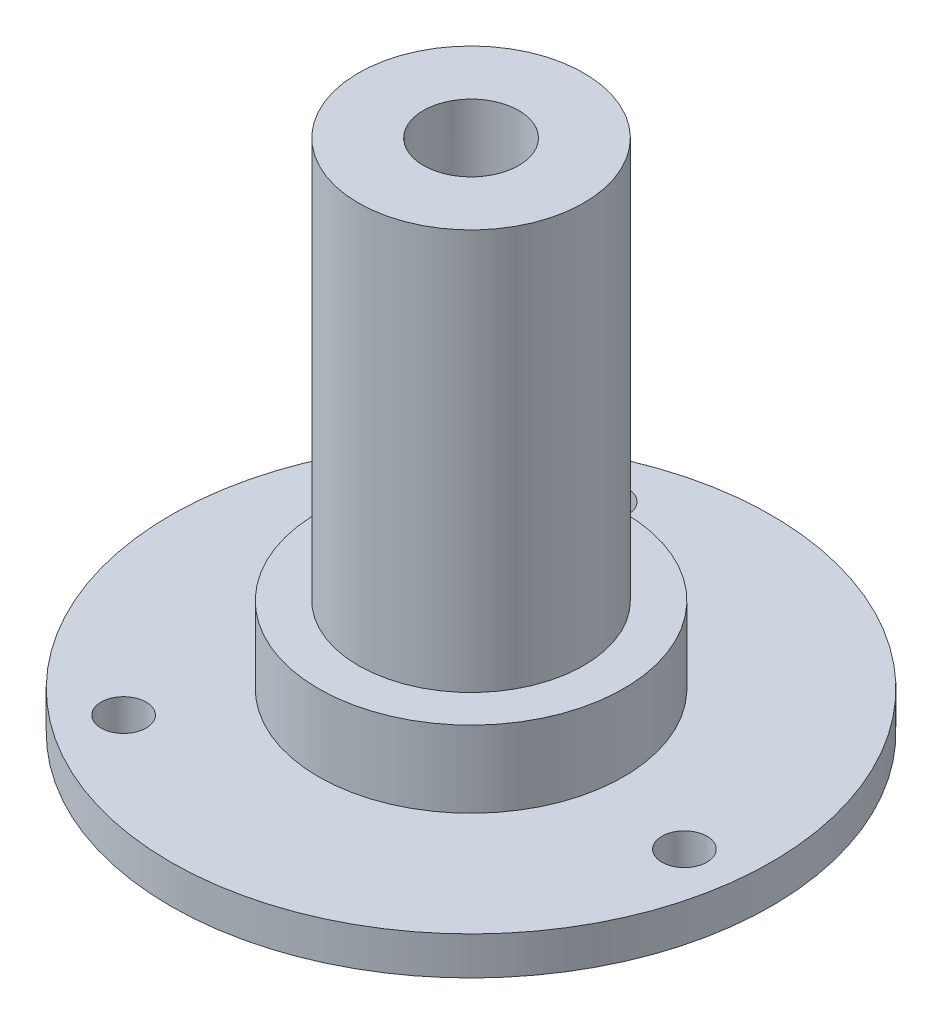
ISO-10303-21;
HEADER;
FILE_DESCRIPTION(('STEP AP214'),'2;1');
FILE_NAME('part.step','',(''),(''),'','','');
FILE_SCHEMA(('AUTOMOTIVE_DESIGN { 1 0 10303 214 1 1 1 1 }'));
ENDSEC;
DATA;
#1=APPLICATION_CONTEXT('core data for automotive mechanical design processes');
#2=APPLICATION_PROTOCOL_DEFINITION('international standard','automotive_design',2000,#1);
#3=PRODUCT_CONTEXT('',#1,'mechanical');
#4=PRODUCT('Part','Part','',(#3));
#5=PRODUCT_RELATED_PRODUCT_CATEGORY('part','',(#4));
#6=PRODUCT_DEFINITION_FORMATION('','',#4);
#7=PRODUCT_DEFINITION_CONTEXT('part definition',#1,'design');
#8=PRODUCT_DEFINITION('design','',#6,#7);
#9=PRODUCT_DEFINITION_SHAPE('','',#8);
#10=(LENGTH_UNIT() NAMED_UNIT(*) SI_UNIT(.MILLI.,.METRE.));
#11=(NAMED_UNIT(*) PLANE_ANGLE_UNIT() SI_UNIT($,.RADIAN.));
#12=(NAMED_UNIT(*) SI_UNIT($,.STERADIAN.) SOLID_ANGLE_UNIT());
#13=UNCERTAINTY_MEASURE_WITH_UNIT(LENGTH_MEASURE(1.E-05),#10,'distance_accuracy_value','');
#14=(GEOMETRIC_REPRESENTATION_CONTEXT(3) GLOBAL_UNCERTAINTY_ASSIGNED_CONTEXT((#13)) GLOBAL_UNIT_ASSIGNED_CONTEXT((#10,
#11,#12)) REPRESENTATION_CONTEXT('',''));
#15=CARTESIAN_POINT('',(0.,0.,0.));
#16=DIRECTION('',(0.,0.,1.));
#17=DIRECTION('',(1.,0.,0.));
#18=AXIS2_PLACEMENT_3D('',#15,#16,#17);
#19=CARTESIAN_POINT('',(0.,0.,0.));
#20=DIRECTION('',(0.,1.,0.));
#21=DIRECTION('',(0.,0.,1.));
#22=AXIS2_PLACEMENT_3D('',#19,#20,#21);
#23=CYLINDRICAL_SURFACE('',#22,3.175);
#24=CARTESIAN_POINT('',(0.,0.,0.));
#25=DIRECTION('',(0.,1.,0.));
#26=DIRECTION('',(0.,0.,1.));
#27=AXIS2_PLACEMENT_3D('',#24,#25,#26);
#28=CIRCLE('',#27,3.175);
#29=CARTESIAN_POINT('',(0.,0.,3.175));
#30=VERTEX_POINT('',#29);
#31=EDGE_CURVE('E142',#30,#30,#28,.T.);
#32=ORIENTED_EDGE('',*,*,#31,.F.);
#33=EDGE_LOOP('',(#32));
#34=FACE_BOUND('',#33,.T.);
#35=CARTESIAN_POINT('',(0.,2.54,0.));
#36=DIRECTION('',(0.,1.,0.));
#37=DIRECTION('',(0.,0.,1.));
#38=AXIS2_PLACEMENT_3D('',#35,#36,#37);
#39=CIRCLE('',#38,3.175);
#40=CARTESIAN_POINT('',(0.,2.54,3.175));
#41=VERTEX_POINT('',#40);
#42=EDGE_CURVE('E10',#41,#41,#39,.F.);
#43=ORIENTED_EDGE('',*,*,#42,.F.);
#44=EDGE_LOOP('',(#43));
#45=FACE_BOUND('',#44,.T.);
#46=ADVANCED_FACE('F32',(#34,#45),#23,.F.);
#47=CARTESIAN_POINT('',(0.,2.54,0.));
#48=DIRECTION('',(0.,-1.,0.));
#49=DIRECTION('',(0.,0.,-1.));
#50=AXIS2_PLACEMENT_3D('',#47,#48,#49);
#51=CYLINDRICAL_SURFACE('',#50,20.);
#52=CARTESIAN_POINT('',(0.,2.54,0.));
#53=DIRECTION('',(0.,1.,0.));
#54=DIRECTION('',(0.,0.,1.));
#55=AXIS2_PLACEMENT_3D('',#52,#53,#54);
#56=CIRCLE('',#55,20.);
#57=CARTESIAN_POINT('',(0.,2.54,20.));
#58=VERTEX_POINT('',#57);
#59=EDGE_CURVE('E40',#58,#58,#56,.T.);
#60=ORIENTED_EDGE('',*,*,#59,.F.);
#61=EDGE_LOOP('',(#60));
#62=FACE_BOUND('',#61,.T.);
#63=CARTESIAN_POINT('',(0.,0.,0.));
#64=DIRECTION('',(0.,1.,0.));
#65=DIRECTION('',(0.,0.,1.));
#66=AXIS2_PLACEMENT_3D('',#63,#64,#65);
#67=CIRCLE('',#66,20.);
#68=CARTESIAN_POINT('',(0.,0.,20.));
#69=VERTEX_POINT('',#68);
#70=EDGE_CURVE('E44',#69,#69,#67,.T.);
#71=ORIENTED_EDGE('',*,*,#70,.T.);
#72=EDGE_LOOP('',(#71));
#73=FACE_BOUND('',#72,.T.);
#74=ADVANCED_FACE('F34',(#62,#73),#51,.T.);
#75=CARTESIAN_POINT('',(0.,2.54,0.));
#76=DIRECTION('',(0.,1.,0.));
#77=DIRECTION('',(0.,0.,1.));
#78=AXIS2_PLACEMENT_3D('',#75,#76,#77);
#79=PLANE('',#78);
#80=CARTESIAN_POINT('',(0.,2.54,0.));
#81=DIRECTION('',(0.,1.,0.));
#82=DIRECTION('',(0.,0.,1.));
#83=AXIS2_PLACEMENT_3D('',#80,#81,#82);
#84=CIRCLE('',#83,10.16);
#85=CARTESIAN_POINT('',(0.,2.54,10.16));
#86=VERTEX_POINT('',#85);
#87=EDGE_CURVE('E191',#86,#86,#84,.T.);
#88=ORIENTED_EDGE('',*,*,#87,.F.);
#89=EDGE_LOOP('',(#88));
#90=FACE_BOUND('',#89,.T.);
#91=CARTESIAN_POINT('',(-10.0438146715116,2.54,13.0893541200269));
#92=DIRECTION('',(0.,1.,0.));
#93=DIRECTION('',(0.,0.,1.));
#94=AXIS2_PLACEMENT_3D('',#91,#92,#93);
#95=CIRCLE('',#94,1.5000000000005);
#96=CARTESIAN_POINT('',(-10.0438146715116,2.54,14.5893541200274));
#97=VERTEX_POINT('',#96);
#98=EDGE_CURVE('E155',#97,#97,#95,.T.);
#99=ORIENTED_EDGE('',*,*,#98,.F.);
#100=EDGE_LOOP('',(#99));
#101=FACE_BOUND('',#100,.T.);
#102=CARTESIAN_POINT('',(16.3576205228284,2.54,2.15352159641826));
#103=DIRECTION('',(0.,1.,0.));
#104=DIRECTION('',(0.,0.,1.));
#105=AXIS2_PLACEMENT_3D('',#102,#103,#104);
#106=CIRCLE('',#105,1.50000000000133);
#107=CARTESIAN_POINT('',(16.3576205228284,2.54,3.65352159641959));
#108=VERTEX_POINT('',#107);
#109=EDGE_CURVE('E150',#108,#108,#106,.T.);
#110=ORIENTED_EDGE('',*,*,#109,.F.);
#111=EDGE_LOOP('',(#110));
#112=FACE_BOUND('',#111,.T.);
#113=CARTESIAN_POINT('',(-6.31380585131877,2.54,-15.2428757164443));
#114=DIRECTION('',(0.,1.,0.));
#115=DIRECTION('',(0.,0.,1.));
#116=AXIS2_PLACEMENT_3D('',#113,#114,#115);
#117=CIRCLE('',#116,1.5);
#118=CARTESIAN_POINT('',(-6.31380585131877,2.54,-13.7428757164443));
#119=VERTEX_POINT('',#118);
#120=EDGE_CURVE('E161',#119,#119,#117,.T.);
#121=ORIENTED_EDGE('',*,*,#120,.F.);
#122=EDGE_LOOP('',(#121));
#123=FACE_BOUND('',#122,.T.);
#124=ORIENTED_EDGE('',*,*,#59,.T.);
#125=EDGE_LOOP('',(#124));
#126=FACE_BOUND('',#125,.T.);
#127=ADVANCED_FACE('F98',(#90,#101,#112,#123,#126),#79,.T.);
#128=CARTESIAN_POINT('',(0.,0.,0.));
#129=DIRECTION('',(0.,1.,0.));
#130=DIRECTION('',(0.,0.,1.));
#131=AXIS2_PLACEMENT_3D('',#128,#129,#130);
#132=PLANE('',#131);
#133=ORIENTED_EDGE('',*,*,#31,.T.);
#134=EDGE_LOOP('',(#133));
#135=FACE_BOUND('',#134,.T.);
#136=CARTESIAN_POINT('',(-10.0438146715116,0.,13.0893541200269));
#137=DIRECTION('',(0.,-1.,0.));
#138=DIRECTION('',(0.,0.,-1.));
#139=AXIS2_PLACEMENT_3D('',#136,#137,#138);
#140=CIRCLE('',#139,1.5000000000005);
#141=CARTESIAN_POINT('',(-10.0438146715116,0.,11.5893541200264));
#142=VERTEX_POINT('',#141);
#143=EDGE_CURVE('E147',#142,#142,#140,.T.);
#144=ORIENTED_EDGE('',*,*,#143,.F.);
#145=EDGE_LOOP('',(#144));
#146=FACE_BOUND('',#145,.T.);
#147=CARTESIAN_POINT('',(16.3576205228284,0.,2.15352159641826));
#148=DIRECTION('',(0.,-1.,0.));
#149=DIRECTION('',(0.,0.,-1.));
#150=AXIS2_PLACEMENT_3D('',#147,#148,#149);
#151=CIRCLE('',#150,1.50000000000133);
#152=CARTESIAN_POINT('',(16.3576205228284,0.,0.653521596416927));
#153=VERTEX_POINT('',#152);
#154=EDGE_CURVE('E144',#153,#153,#151,.T.);
#155=ORIENTED_EDGE('',*,*,#154,.F.);
#156=EDGE_LOOP('',(#155));
#157=FACE_BOUND('',#156,.T.);
#158=CARTESIAN_POINT('',(-6.31380585131877,0.,-15.2428757164443));
#159=DIRECTION('',(0.,-1.,0.));
#160=DIRECTION('',(0.,0.,-1.));
#161=AXIS2_PLACEMENT_3D('',#158,#159,#160);
#162=CIRCLE('',#161,1.5);
#163=CARTESIAN_POINT('',(-6.31380585131877,0.,-16.7428757164443));
#164=VERTEX_POINT('',#163);
#165=EDGE_CURVE('E158',#164,#164,#162,.T.);
#166=ORIENTED_EDGE('',*,*,#165,.F.);
#167=EDGE_LOOP('',(#166));
#168=FACE_BOUND('',#167,.T.);
#169=ORIENTED_EDGE('',*,*,#70,.F.);
#170=EDGE_LOOP('',(#169));
#171=FACE_BOUND('',#170,.T.);
#172=ADVANCED_FACE('F101',(#135,#146,#157,#168,#171),#132,.F.);
#173=CARTESIAN_POINT('',(-6.31380585131877,34.29,-15.2428757164443));
#174=DIRECTION('',(0.,-1.,0.));
#175=DIRECTION('',(0.,0.,-1.));
#176=AXIS2_PLACEMENT_3D('',#173,#174,#175);
#177=CYLINDRICAL_SURFACE('',#176,1.5);
#178=ORIENTED_EDGE('',*,*,#120,.T.);
#179=EDGE_LOOP('',(#178));
#180=FACE_BOUND('',#179,.T.);
#181=ORIENTED_EDGE('',*,*,#165,.T.);
#182=EDGE_LOOP('',(#181));
#183=FACE_BOUND('',#182,.T.);
#184=ADVANCED_FACE('F104',(#180,#183),#177,.F.);
#185=CARTESIAN_POINT('',(16.3576205228284,34.29,2.15352159641826));
#186=DIRECTION('',(0.,-1.,0.));
#187=DIRECTION('',(0.,0.,-1.));
#188=AXIS2_PLACEMENT_3D('',#185,#186,#187);
#189=CYLINDRICAL_SURFACE('',#188,1.50000000000133);
#190=ORIENTED_EDGE('',*,*,#109,.T.);
#191=EDGE_LOOP('',(#190));
#192=FACE_BOUND('',#191,.T.);
#193=ORIENTED_EDGE('',*,*,#154,.T.);
#194=EDGE_LOOP('',(#193));
#195=FACE_BOUND('',#194,.T.);
#196=ADVANCED_FACE('F109',(#192,#195),#189,.F.);
#197=CARTESIAN_POINT('',(-10.0438146715116,34.29,13.0893541200269));
#198=DIRECTION('',(0.,-1.,0.));
#199=DIRECTION('',(0.,0.,-1.));
#200=AXIS2_PLACEMENT_3D('',#197,#198,#199);
#201=CYLINDRICAL_SURFACE('',#200,1.5000000000005);
#202=ORIENTED_EDGE('',*,*,#98,.T.);
#203=EDGE_LOOP('',(#202));
#204=FACE_BOUND('',#203,.T.);
#205=ORIENTED_EDGE('',*,*,#143,.T.);
#206=EDGE_LOOP('',(#205));
#207=FACE_BOUND('',#206,.T.);
#208=ADVANCED_FACE('F216',(#204,#207),#201,.F.);
#209=CARTESIAN_POINT('',(0.,2.54,0.));
#210=DIRECTION('',(0.,1.,0.));
#211=DIRECTION('',(0.,0.,1.));
#212=AXIS2_PLACEMENT_3D('',#209,#210,#211);
#213=PLANE('',#212);
#214=ORIENTED_EDGE('',*,*,#42,.T.);
#215=EDGE_LOOP('',(#214));
#216=FACE_BOUND('',#215,.T.);
#217=ADVANCED_FACE('F183',(#216),#213,.F.);
#218=CARTESIAN_POINT('',(0.,7.62,0.));
#219=DIRECTION('',(0.,1.,0.));
#220=DIRECTION('',(0.,0.,1.));
#221=AXIS2_PLACEMENT_3D('',#218,#219,#220);
#222=PLANE('',#221);
#223=CARTESIAN_POINT('',(0.,7.62,0.));
#224=DIRECTION('',(0.,1.,0.));
#225=DIRECTION('',(0.,0.,1.));
#226=AXIS2_PLACEMENT_3D('',#223,#224,#225);
#227=CIRCLE('',#226,10.16);
#228=CARTESIAN_POINT('',(0.,7.62,10.16));
#229=VERTEX_POINT('',#228);
#230=EDGE_CURVE('E188',#229,#229,#227,.T.);
#231=ORIENTED_EDGE('',*,*,#230,.T.);
#232=EDGE_LOOP('',(#231));
#233=FACE_BOUND('',#232,.T.);
#234=CARTESIAN_POINT('',(0.,7.62,0.));
#235=DIRECTION('',(0.,1.,0.));
#236=DIRECTION('',(0.,0.,1.));
#237=AXIS2_PLACEMENT_3D('',#234,#235,#236);
#238=CIRCLE('',#237,7.499999986);
#239=CARTESIAN_POINT('',(0.,7.62,7.499999986));
#240=VERTEX_POINT('',#239);
#241=EDGE_CURVE('E56',#240,#240,#238,.T.);
#242=ORIENTED_EDGE('',*,*,#241,.F.);
#243=EDGE_LOOP('',(#242));
#244=FACE_BOUND('',#243,.T.);
#245=ADVANCED_FACE('F129',(#233,#244),#222,.T.);
#246=CARTESIAN_POINT('',(0.,7.62,0.));
#247=DIRECTION('',(0.,-1.,0.));
#248=DIRECTION('',(0.,0.,-1.));
#249=AXIS2_PLACEMENT_3D('',#246,#247,#248);
#250=CYLINDRICAL_SURFACE('',#249,10.16);
#251=ORIENTED_EDGE('',*,*,#230,.F.);
#252=EDGE_LOOP('',(#251));
#253=FACE_BOUND('',#252,.T.);
#254=ORIENTED_EDGE('',*,*,#87,.T.);
#255=EDGE_LOOP('',(#254));
#256=FACE_BOUND('',#255,.T.);
#257=ADVANCED_FACE('F72',(#253,#256),#250,.T.);
#258=CARTESIAN_POINT('',(0.,34.29,0.));
#259=DIRECTION('',(0.,1.,0.));
#260=DIRECTION('',(0.,0.,1.));
#261=AXIS2_PLACEMENT_3D('',#258,#259,#260);
#262=PLANE('',#261);
#263=CARTESIAN_POINT('',(0.,34.29,0.));
#264=DIRECTION('',(0.,1.,0.));
#265=DIRECTION('',(0.,0.,1.));
#266=AXIS2_PLACEMENT_3D('',#263,#264,#265);
#267=CIRCLE('',#266,3.175);
#268=CARTESIAN_POINT('',(0.,34.29,3.175));
#269=VERTEX_POINT('',#268);
#270=EDGE_CURVE('E140',#269,#269,#267,.T.);
#271=ORIENTED_EDGE('',*,*,#270,.F.);
#272=EDGE_LOOP('',(#271));
#273=FACE_BOUND('',#272,.T.);
#274=CARTESIAN_POINT('',(0.,34.29,0.));
#275=DIRECTION('',(0.,1.,0.));
#276=DIRECTION('',(0.,0.,1.));
#277=AXIS2_PLACEMENT_3D('',#274,#275,#276);
#278=CIRCLE('',#277,7.499999986);
#279=CARTESIAN_POINT('',(0.,34.29,7.499999986));
#280=VERTEX_POINT('',#279);
#281=EDGE_CURVE('E164',#280,#280,#278,.T.);
#282=ORIENTED_EDGE('',*,*,#281,.T.);
#283=EDGE_LOOP('',(#282));
#284=FACE_BOUND('',#283,.T.);
#285=ADVANCED_FACE('F96',(#273,#284),#262,.T.);
#286=CARTESIAN_POINT('',(-20.,22.29,0.));
#287=DIRECTION('',(1.,0.,0.));
#288=DIRECTION('',(0.,0.,-1.));
#289=AXIS2_PLACEMENT_3D('',#286,#287,#288);
#290=CYLINDRICAL_SURFACE('',#289,1.397);
#291=CARTESIAN_POINT('',(-2.85114292872174,22.29,-1.397));
#292=CARTESIAN_POINT('',(-2.85115237351835,22.2159268114621,-1.39699065371324));
#293=CARTESIAN_POINT('',(-2.85407201783555,22.1417516850457,-1.39107141452209));
#294=CARTESIAN_POINT('',(-2.86537105010901,21.9955687487075,-1.36763678442378));
#295=CARTESIAN_POINT('',(-2.87376444664616,21.9235669969876,-1.3500916383119));
#296=CARTESIAN_POINT('',(-2.89485679097946,21.7841216818082,-1.30424614599699));
#297=CARTESIAN_POINT('',(-2.90753678551636,21.7166595940755,-1.27599307955427));
#298=CARTESIAN_POINT('',(-2.93574659643726,21.5874498661741,-1.20967369800455));
#299=CARTESIAN_POINT('',(-2.95127596563693,21.5257013315977,-1.17160892238019));
#300=CARTESIAN_POINT('',(-2.98464090455019,21.4053420245741,-1.0839173194949));
#301=CARTESIAN_POINT('',(-3.00256017960633,21.3471756089834,-1.0337121734898));
#302=CARTESIAN_POINT('',(-3.0380018380997,21.2397550261967,-0.924376309969724));
#303=CARTESIAN_POINT('',(-3.055524055301,21.1905045336442,-0.86524193065772));
#304=CARTESIAN_POINT('',(-3.08923496638304,21.099953197666,-0.736146899468411));
#305=CARTESIAN_POINT('',(-3.10531516695498,21.0591646567176,-0.665795972060948));
#306=CARTESIAN_POINT('',(-3.13328998408337,20.9901970393407,-0.518393954944971));
#307=CARTESIAN_POINT('',(-3.1451866614389,20.9620117526991,-0.441346187486855));
#308=CARTESIAN_POINT('',(-3.16285806619951,20.9206996977336,-0.287414778923227));
#309=CARTESIAN_POINT('',(-3.16894424098825,20.9068033130397,-0.210774193800686));
#310=CARTESIAN_POINT('',(-3.17544845547862,20.8919641034125,-0.0560240862312617));
#311=CARTESIAN_POINT('',(-3.17586907757888,20.8910153768434,0.022084750717096));
#312=CARTESIAN_POINT('',(-3.17116900154512,20.9017226799324,0.171909439782902));
#313=CARTESIAN_POINT('',(-3.16642165087473,20.9125294248871,0.24370000391672));
#314=CARTESIAN_POINT('',(-3.15244550602921,20.9449683903399,0.384326949447742));
#315=CARTESIAN_POINT('',(-3.14321638012469,20.9666014121746,0.453163111757223));
#316=CARTESIAN_POINT('',(-3.12097860594305,21.0203164638681,0.587203351522346));
#317=CARTESIAN_POINT('',(-3.1079143803762,21.0525530505242,0.652335890138428));
#318=CARTESIAN_POINT('',(-3.07925817812088,21.1263971233842,0.776438317360146));
#319=CARTESIAN_POINT('',(-3.06366528356653,21.1680080144513,0.835405955375684));
#320=CARTESIAN_POINT('',(-3.03006776985349,21.2631482631757,0.950353661142522));
#321=CARTESIAN_POINT('',(-3.01196989645416,21.3173502597936,1.00575048811671));
#322=CARTESIAN_POINT('',(-2.97627243690402,21.4342673302773,1.10693826469219));
#323=CARTESIAN_POINT('',(-2.95867309274512,21.4969864556846,1.15272461610552));
#324=CARTESIAN_POINT('',(-2.92525432672669,21.6323089438104,1.23514086723043));
#325=CARTESIAN_POINT('',(-2.90953477297595,21.7052081051539,1.27132919138321));
#326=CARTESIAN_POINT('',(-2.88288185240244,21.8569380810136,1.33067189110848));
#327=CARTESIAN_POINT('',(-2.87194461119493,21.9357640330389,1.35383682193193));
#328=CARTESIAN_POINT('',(-2.85708899602545,22.0912496267258,1.3848992054064));
#329=CARTESIAN_POINT('',(-2.85273381561134,22.1676761500265,1.39374985362834));
#330=CARTESIAN_POINT('',(-2.85028280058242,22.3210301876081,1.39875824343376));
#331=CARTESIAN_POINT('',(-2.85218434839454,22.3979574789473,1.39492129301443));
#332=CARTESIAN_POINT('',(-2.86157722575447,22.5440324471271,1.37553552668914));
#333=CARTESIAN_POINT('',(-2.86863871458494,22.6133309360522,1.36088649715055));
#334=CARTESIAN_POINT('',(-2.88698336965366,22.748411716313,1.32152182874358));
#335=CARTESIAN_POINT('',(-2.89826760159835,22.8141931152365,1.29680364855362));
#336=CARTESIAN_POINT('',(-2.92439244326778,22.9436499193854,1.23679686862192));
#337=CARTESIAN_POINT('',(-2.93936876620891,23.0071019674859,1.20108748926754));
#338=CARTESIAN_POINT('',(-2.97101722516595,23.1274393066735,1.12051485206167));
#339=CARTESIAN_POINT('',(-2.98769014785859,23.1843215251332,1.07564733799245));
#340=CARTESIAN_POINT('',(-3.02271731647178,23.2954037762479,0.973138693965348));
#341=CARTESIAN_POINT('',(-3.04108409203716,23.348865860621,0.914698839635639));
#342=CARTESIAN_POINT('',(-3.07602015444843,23.4453835297442,0.789277579543786));
#343=CARTESIAN_POINT('',(-3.09258920896537,23.4884377703146,0.722295072197236));
#344=CARTESIAN_POINT('',(-3.1222658607023,23.5630718171182,0.580807627369469));
#345=CARTESIAN_POINT('',(-3.1353466779445,23.5945635123384,0.506250237967001));
#346=CARTESIAN_POINT('',(-3.15636397616119,23.6443007086138,0.352165202603912));
#347=CARTESIAN_POINT('',(-3.16430391016354,23.6625551018893,0.27264093224431));
#348=CARTESIAN_POINT('',(-3.1737066814273,23.6840882230022,0.117434515311565));
#349=CARTESIAN_POINT('',(-3.17561775975148,23.6884039302117,0.0419225938853239));
#350=CARTESIAN_POINT('',(-3.17403067411367,23.6847969635917,-0.108741515299149));
#351=CARTESIAN_POINT('',(-3.17053366389819,23.6768769001077,-0.183893776355563));
#352=CARTESIAN_POINT('',(-3.15877144263482,23.6497646425261,-0.328362162745011));
#353=CARTESIAN_POINT('',(-3.15071704382124,23.6310701756749,-0.39779036890816));
#354=CARTESIAN_POINT('',(-3.13077187732552,23.5835150033947,-0.532476762229073));
#355=CARTESIAN_POINT('',(-3.1188804271479,23.5546524892937,-0.597734205058264));
#356=CARTESIAN_POINT('',(-3.09171284763054,23.4861211121264,-0.725534460076795));
#357=CARTESIAN_POINT('',(-3.07630660014345,23.446017705601,-0.787815889572078));
#358=CARTESIAN_POINT('',(-3.04388500798139,23.3567466360167,-0.905038116397345));
#359=CARTESIAN_POINT('',(-3.0268689952561,23.3075752016314,-0.959975843077447));
#360=CARTESIAN_POINT('',(-2.99147676873221,23.1971160892396,-1.06537138055794));
#361=CARTESIAN_POINT('',(-2.97309677785144,23.1351867442087,-1.11515778893816));
#362=CARTESIAN_POINT('',(-2.93833921881178,23.0033418987289,-1.20376965001077));
#363=CARTESIAN_POINT('',(-2.9219628780433,22.9334215533893,-1.24258840303861));
#364=CARTESIAN_POINT('',(-2.89326263757394,22.7870975396935,-1.30802960707691));
#365=CARTESIAN_POINT('',(-2.88094755541364,22.7106802117768,-1.33462556935872));
#366=CARTESIAN_POINT('',(-2.86227990714155,22.5538620278262,-1.37421886584385));
#367=CARTESIAN_POINT('',(-2.85590734305675,22.4734754979351,-1.38726182615555));
#368=CARTESIAN_POINT('',(-2.85175589053665,22.3584509264366,-1.39574613644726));
#369=CARTESIAN_POINT('',(-2.85113856337198,22.3242363514779,-1.39700431981888));
#370=CARTESIAN_POINT('',(-2.85114292872174,22.29,-1.397));
#371=B_SPLINE_CURVE_WITH_KNOTS('',3,(#291,#292,#293,#294,#295,#296,#297,#298,#299,#300,#301,
#302,#303,#304,#305,#306,#307,#308,#309,#310,#311,#312,#313,#314,#315,#316,#317,#318,#319,#320,
#321,#322,#323,#324,#325,#326,#327,#328,#329,#330,#331,#332,#333,#334,#335,#336,#337,#338,#339,
#340,#341,#342,#343,#344,#345,#346,#347,#348,#349,#350,#351,#352,#353,#354,#355,#356,#357,#358,
#359,#360,#361,#362,#363,#364,#365,#366,#367,#368,#369,#370),.UNSPECIFIED.,.T.,.F.,(4,2,2,2,2,2,
2,2,2,2,2,2,2,2,2,2,2,2,2,2,2,2,2,2,2,2,2,2,2,2,2,2,2,2,2,2,2,2,2,4),(0.,0.222112833227812,
0.444796346466132,0.666507866168926,0.888184619911234,1.12385942569784,1.35963114337787,
1.607038959742,1.8543247319941,2.08745558342925,2.32048016859061,2.53772355428628,
2.75498302222616,2.97556103393812,3.1962192918492,3.43393357366905,3.67176133331135,
3.91914038658706,4.16631865300341,4.39623594595358,4.62605706263393,4.8386450817837,
5.05128678863692,5.27337439349211,5.49556544892056,5.73836208374816,5.98119005918262,
6.22583184984156,6.47030914859581,6.69612064448005,6.9218839730155,7.13797005134527,
7.35409458606465,7.58012175104373,7.80624313193341,8.04978849200224,8.29348230328488,
8.53770177582031,8.78109639461826,8.88375611774129),.UNSPECIFIED.);
#372=CARTESIAN_POINT('',(-2.85114292872174,22.29,-1.397));
#373=VERTEX_POINT('',#372);
#374=EDGE_CURVE('E57',#373,#373,#371,.T.);
#375=ORIENTED_EDGE('',*,*,#374,.F.);
#376=EDGE_LOOP('',(#375));
#377=FACE_BOUND('',#376,.T.);
#378=CARTESIAN_POINT('',(-7.36874417998074,22.29,-1.397));
#379=CARTESIAN_POINT('',(-7.36874567951552,22.3677362789763,-1.39699700860188));
#380=CARTESIAN_POINT('',(-7.3699876501678,22.4455114792839,-1.39048951777028));
#381=CARTESIAN_POINT('',(-7.37481525837138,22.5988694814984,-1.36464865246752));
#382=CARTESIAN_POINT('',(-7.37840289481109,22.6744503560598,-1.34530433872686));
#383=CARTESIAN_POINT('',(-7.38750173093611,22.8211785293357,-1.29440393146433));
#384=CARTESIAN_POINT('',(-7.39301114984175,22.8923298609109,-1.2628591403266));
#385=CARTESIAN_POINT('',(-7.40533067048864,23.0283257508165,-1.18848304927391));
#386=CARTESIAN_POINT('',(-7.41214066794774,23.0931708141634,-1.14565265414944));
#387=CARTESIAN_POINT('',(-7.42638746845838,23.2155150080667,-1.0493603400114));
#388=CARTESIAN_POINT('',(-7.43383034561192,23.2729254273253,-0.995786590686065));
#389=CARTESIAN_POINT('',(-7.44845061385963,23.3779978919822,-0.879770021526041));
#390=CARTESIAN_POINT('',(-7.45562798760851,23.4256593013976,-0.817326623524053));
#391=CARTESIAN_POINT('',(-7.46897357450735,23.5102203251769,-0.684761095784534));
#392=CARTESIAN_POINT('',(-7.47513379765325,23.5470363645533,-0.614584781945084));
#393=CARTESIAN_POINT('',(-7.48568302786363,23.6083232073165,-0.4689091385714));
#394=CARTESIAN_POINT('',(-7.49007217863225,23.6327950123503,-0.393410241493745));
#395=CARTESIAN_POINT('',(-7.49654182474955,23.6684245875312,-0.240151684364763));
#396=CARTESIAN_POINT('',(-7.49864822740388,23.6797318759353,-0.16242789604861));
#397=CARTESIAN_POINT('',(-7.50040432096573,23.6891772635815,-0.0061598012827558));
#398=CARTESIAN_POINT('',(-7.50005421844217,23.6873164701349,0.0723844356203489));
#399=CARTESIAN_POINT('',(-7.49695701083831,23.6705933056889,0.227038655152682));
#400=CARTESIAN_POINT('',(-7.49423958716248,23.6558919237098,0.303166726191265));
#401=CARTESIAN_POINT('',(-7.48674634652005,23.6141594483416,0.451856197816771));
#402=CARTESIAN_POINT('',(-7.48197045526637,23.5871279099732,0.524417469577839));
#403=CARTESIAN_POINT('',(-7.47084723478552,23.5213486454764,0.664381293443695));
#404=CARTESIAN_POINT('',(-7.46449129316078,23.4825364412431,0.731752830167273));
#405=CARTESIAN_POINT('',(-7.45091107672916,23.3943450735614,0.859086981758142));
#406=CARTESIAN_POINT('',(-7.44368671476309,23.3449648490628,0.919048851725865));
#407=CARTESIAN_POINT('',(-7.42904101128834,23.2361516654209,1.03081525852825));
#408=CARTESIAN_POINT('',(-7.42161834336418,23.1765778703222,1.08248259963254));
#409=CARTESIAN_POINT('',(-7.40751720090312,23.04953811171,1.1751130625041));
#410=CARTESIAN_POINT('',(-7.40083873697608,22.9820720357072,1.21607603167406));
#411=CARTESIAN_POINT('',(-7.388980307478,22.8409823465434,1.28617331976538));
#412=CARTESIAN_POINT('',(-7.38380284486208,22.7673487093121,1.31528791350233));
#413=CARTESIAN_POINT('',(-7.3755711287047,22.6161168588016,1.36069397754509));
#414=CARTESIAN_POINT('',(-7.37251663798983,22.538519089426,1.3769868802869));
#415=CARTESIAN_POINT('',(-7.36892356645935,22.3827982492177,1.39608719810038));
#416=CARTESIAN_POINT('',(-7.36834823332566,22.3047001666519,1.39909162625116));
#417=CARTESIAN_POINT('',(-7.36968029780963,22.1491181919655,1.39205763407676));
#418=CARTESIAN_POINT('',(-7.3715875743438,22.0716342700761,1.38201984985512));
#419=CARTESIAN_POINT('',(-7.37763573868555,21.9201264315482,1.34935542841215));
#420=CARTESIAN_POINT('',(-7.38175832630764,21.84607949208,1.32683188571294));
#421=CARTESIAN_POINT('',(-7.39175686004092,21.7028105260986,1.26994461709819));
#422=CARTESIAN_POINT('',(-7.39763293389522,21.6335888515638,1.23558002852323));
#423=CARTESIAN_POINT('',(-7.41056015374399,21.5010668775144,1.15553199537858));
#424=CARTESIAN_POINT('',(-7.41762393178187,21.4378430768275,1.10972398313161));
#425=CARTESIAN_POINT('',(-7.43209502993001,21.3199082901665,1.0082575842306));
#426=CARTESIAN_POINT('',(-7.43950238046273,21.265198059922,0.952598324040811));
#427=CARTESIAN_POINT('',(-7.45394398823969,21.165108436054,0.832129908614387));
#428=CARTESIAN_POINT('',(-7.4609720441796,21.1198614733646,0.767209864504669));
#429=CARTESIAN_POINT('',(-7.47375915654082,21.0409169833469,0.630575213592999));
#430=CARTESIAN_POINT('',(-7.47951826136408,21.0072190154748,0.558860866097274));
#431=CARTESIAN_POINT('',(-7.48909189017046,20.9525278127437,0.411040928520295));
#432=CARTESIAN_POINT('',(-7.49291639267434,20.9314692774574,0.334960173196727));
#433=CARTESIAN_POINT('',(-7.49823244296502,20.9024461915867,0.180263806389474));
#434=CARTESIAN_POINT('',(-7.49972423286438,20.8944802821124,0.101648458835997));
#435=CARTESIAN_POINT('',(-7.50020204608563,20.8919153720189,-0.0546149725000097));
#436=CARTESIAN_POINT('',(-7.4992255819268,20.8971162642365,-0.132259727965006));
#437=CARTESIAN_POINT('',(-7.49495446900305,20.9202993950618,-0.285548554041623));
#438=CARTESIAN_POINT('',(-7.49165984183761,20.9382815145806,-0.361192643287632));
#439=CARTESIAN_POINT('',(-7.48312246990609,20.9864327870721,-0.508228931604508));
#440=CARTESIAN_POINT('',(-7.47788308899169,21.0165809042538,-0.579628226950086));
#441=CARTESIAN_POINT('',(-7.46602367748758,21.0881845043016,-0.716384781266516));
#442=CARTESIAN_POINT('',(-7.45940355603307,21.1296407313955,-0.781741642183677));
#443=CARTESIAN_POINT('',(-7.44539523404043,21.2233738451128,-0.905555934347141));
#444=CARTESIAN_POINT('',(-7.43799749764893,21.2757954278457,-0.963902757708738));
#445=CARTESIAN_POINT('',(-7.42332825434519,21.3896707011153,-1.07104099011996));
#446=CARTESIAN_POINT('',(-7.41605677751664,21.4511265120818,-1.11983014959573));
#447=CARTESIAN_POINT('',(-7.40239100687261,21.5819953929405,-1.20688527949439));
#448=CARTESIAN_POINT('',(-7.39600530930837,21.6514758642127,-1.2450513160267));
#449=CARTESIAN_POINT('',(-7.38493741000142,21.7959586853366,-1.30910833404253));
#450=CARTESIAN_POINT('',(-7.38025359537039,21.8709557255931,-1.33501094476709));
#451=CARTESIAN_POINT('',(-7.37410031625938,22.0034823096103,-1.36851885465482));
#452=CARTESIAN_POINT('',(-7.37210364509724,22.0602341889015,-1.3791810533322));
#453=CARTESIAN_POINT('',(-7.36942503805681,22.1746502507922,-1.39342264176112));
#454=CARTESIAN_POINT('',(-7.36874306722424,22.2323144090955,-1.39700221982027));
#455=CARTESIAN_POINT('',(-7.36874417998074,22.29,-1.397));
#456=B_SPLINE_CURVE_WITH_KNOTS('',3,(#378,#379,#380,#381,#382,#383,#384,#385,#386,#387,#388,
#389,#390,#391,#392,#393,#394,#395,#396,#397,#398,#399,#400,#401,#402,#403,#404,#405,#406,#407,
#408,#409,#410,#411,#412,#413,#414,#415,#416,#417,#418,#419,#420,#421,#422,#423,#424,#425,#426,
#427,#428,#429,#430,#431,#432,#433,#434,#435,#436,#437,#438,#439,#440,#441,#442,#443,#444,#445,
#446,#447,#448,#449,#450,#451,#452,#453,#454,#455),.UNSPECIFIED.,.T.,.F.,(4,2,2,2,2,2,2,2,2,2,2,
2,2,2,2,2,2,2,2,2,2,2,2,2,2,2,2,2,2,2,2,2,2,2,2,2,2,2,4),(0.,0.232997745459988,
0.466194302100189,0.699175343539416,0.93213771208109,1.16766425423181,1.40320615621191,
1.64051832814463,1.87781124078343,2.11238192346498,2.34693288120154,2.5785846947373,
2.81024486894774,3.04319655908901,3.2761716490259,3.51267279672402,3.74917731570565,
3.98607397255396,4.22294415961026,4.45629051073988,4.68962548137182,4.92106190752468,
5.15251519815413,5.38660702863447,5.62071962705479,5.85791667038618,6.09510466467915,
6.3310564589119,6.56698376205034,6.79934706846482,7.03170820986337,7.26366929371933,
7.49564564745926,7.73090168341119,7.96621302489004,8.20366843463039,8.44089821534782,
8.61380294100395,8.78670306953174),.UNSPECIFIED.);
#457=CARTESIAN_POINT('',(-7.36874417998074,22.29,-1.397));
#458=VERTEX_POINT('',#457);
#459=EDGE_CURVE('E86',#458,#458,#456,.T.);
#460=ORIENTED_EDGE('',*,*,#459,.F.);
#461=EDGE_LOOP('',(#460));
#462=FACE_BOUND('',#461,.T.);
#463=ADVANCED_FACE('F74',(#377,#462),#290,.F.);
#464=CARTESIAN_POINT('',(0.,34.29,0.));
#465=DIRECTION('',(0.,-1.,0.));
#466=DIRECTION('',(0.,0.,-1.));
#467=AXIS2_PLACEMENT_3D('',#464,#465,#466);
#468=CYLINDRICAL_SURFACE('',#467,7.499999986);
#469=ORIENTED_EDGE('',*,*,#241,.T.);
#470=EDGE_LOOP('',(#469));
#471=FACE_BOUND('',#470,.T.);
#472=CARTESIAN_POINT('',(0.,28.687,-7.499999986));
#473=CARTESIAN_POINT('',(-0.0777494679592904,28.6869970191396,-7.49999858132261));
#474=CARTESIAN_POINT('',(-0.155537827641433,28.6804873946361,-7.49877850040809));
#475=CARTESIAN_POINT('',(-0.308923157396296,28.6546372862178,-7.49402894776823));
#476=CARTESIAN_POINT('',(-0.384518210795967,28.6352859129702,-7.49049751613697));
#477=CARTESIAN_POINT('',(-0.531276404600925,28.5843648649916,-7.48152036333405));
#478=CARTESIAN_POINT('',(-0.602443457764712,28.5528061603911,-7.47607636129764));
#479=CARTESIAN_POINT('',(-0.738465826847455,28.4783972767411,-7.46386880090175));
#480=CARTESIAN_POINT('',(-0.803321666074229,28.4355480349649,-7.45710535208699));
#481=CARTESIAN_POINT('',(-0.925654260053187,28.3392364445292,-7.44291618976836));
#482=CARTESIAN_POINT('',(-0.983045584665462,28.2856664950274,-7.43548422066737));
#483=CARTESIAN_POINT('',(-1.08808103399833,28.1696656167707,-7.42084216556298));
#484=CARTESIAN_POINT('',(-1.13572446407502,28.107234057066,-7.41363209540338));
#485=CARTESIAN_POINT('',(-1.220266226356,27.9746794638925,-7.40018939810409));
#486=CARTESIAN_POINT('',(-1.25707780549646,27.9045002103131,-7.39396483772924));
#487=CARTESIAN_POINT('',(-1.31835559876541,27.7588182010724,-7.38328598738381));
#488=CARTESIAN_POINT('',(-1.34282286293921,27.6833158988289,-7.37883154684827));
#489=CARTESIAN_POINT('',(-1.3784436241492,27.530044602942,-7.37226020370753));
#490=CARTESIAN_POINT('',(-1.38974601645424,27.4523113551028,-7.37011717981725));
#491=CARTESIAN_POINT('',(-1.3991783312826,27.2960245673551,-7.36833254061868));
#492=CARTESIAN_POINT('',(-1.39730941939215,27.2174711006456,-7.36869070396939));
#493=CARTESIAN_POINT('',(-1.38057294619143,27.0628514592746,-7.37184418505725));
#494=CARTESIAN_POINT('',(-1.36587456818216,26.9867662292796,-7.3746077808189));
#495=CARTESIAN_POINT('',(-1.32416277600144,26.8381608689659,-7.38221092299356));
#496=CARTESIAN_POINT('',(-1.29714884474788,26.76564088848,-7.3870505565708));
#497=CARTESIAN_POINT('',(-1.23140694066643,26.625728868574,-7.3982936995197));
#498=CARTESIAN_POINT('',(-1.19261053339208,26.5583697460262,-7.404706301928));
#499=CARTESIAN_POINT('',(-1.10445337550353,26.4310538179915,-7.41836681266982));
#500=CARTESIAN_POINT('',(-1.05509156632738,26.3710977551771,-7.42561480466856));
#501=CARTESIAN_POINT('',(-0.946292043476813,26.2593122693741,-7.44026772236616));
#502=CARTESIAN_POINT('',(-0.886709593609555,26.2076237034358,-7.44767333586812));
#503=CARTESIAN_POINT('',(-0.759644754545029,26.1149544573161,-7.4617034627147));
#504=CARTESIAN_POINT('',(-0.692162288108534,26.0739738818404,-7.46832796842109));
#505=CARTESIAN_POINT('',(-0.551066966919416,26.0038636481124,-7.48006258614288));
#506=CARTESIAN_POINT('',(-0.477446736843739,25.9747485023443,-7.48517084158722));
#507=CARTESIAN_POINT('',(-0.326244198485178,25.9293372836365,-7.4932830186326));
#508=CARTESIAN_POINT('',(-0.248662306394965,25.9130398670678,-7.49628716079543));
#509=CARTESIAN_POINT('',(-0.0929506906192601,25.8939224709925,-7.49982236925298));
#510=CARTESIAN_POINT('',(-0.0148454425507424,25.8909094727003,-7.50038885111833));
#511=CARTESIAN_POINT('',(0.140752873338072,25.8979288840187,-7.49908268887012));
#512=CARTESIAN_POINT('',(0.218245970642367,25.9079606614307,-7.49721016295996));
#513=CARTESIAN_POINT('',(0.369809010039429,25.9406243788382,-7.49125843039994));
#514=CARTESIAN_POINT('',(0.443900701871375,25.9631587828065,-7.48719631219065));
#515=CARTESIAN_POINT('',(0.587254407256603,26.0200826336775,-7.477318992444));
#516=CARTESIAN_POINT('',(0.656516095882213,26.0544728772323,-7.47150367310377));
#517=CARTESIAN_POINT('',(0.789068379674807,26.1345603269222,-7.4586766778807));
#518=CARTESIAN_POINT('',(0.852286407348126,26.1803756383914,-7.45165275950251));
#519=CARTESIAN_POINT('',(0.97020618472502,26.2818527138541,-7.43721959252621));
#520=CARTESIAN_POINT('',(1.02490714948303,26.3375153843867,-7.42981030849606));
#521=CARTESIAN_POINT('',(1.12497236512897,26.4579804584392,-7.41532417506863));
#522=CARTESIAN_POINT('',(1.17020497184152,26.5228930016674,-7.4082529494318));
#523=CARTESIAN_POINT('',(1.24912430585681,26.6595083985442,-7.39535623925583));
#524=CARTESIAN_POINT('',(1.28281145875268,26.7312110017705,-7.38953070880036));
#525=CARTESIAN_POINT('',(1.33749635093651,26.8790348361799,-7.37982899664746));
#526=CARTESIAN_POINT('',(1.35855474883916,26.9551329887092,-7.375943511823));
#527=CARTESIAN_POINT('',(1.38757168159262,27.1098664011749,-7.37054043538021));
#528=CARTESIAN_POINT('',(1.39553167281688,27.1885013780579,-7.36902258051303));
#529=CARTESIAN_POINT('',(1.39807760581978,27.3447579000785,-7.36853984983489));
#530=CARTESIAN_POINT('',(1.3928711737383,27.4223760159257,-7.36953533976445));
#531=CARTESIAN_POINT('',(1.36968626700253,27.5756100922305,-7.37387931086799));
#532=CARTESIAN_POINT('',(1.35170786628363,27.6512260642758,-7.37722777842087));
#533=CARTESIAN_POINT('',(1.30357647487328,27.7981996565503,-7.38588382611802));
#534=CARTESIAN_POINT('',(1.27344568196607,27.869564770157,-7.39118783272987));
#535=CARTESIAN_POINT('',(1.20188742520407,28.0062600670446,-7.40315991143097));
#536=CARTESIAN_POINT('',(1.16045917774739,28.0715898312873,-7.40982807813162));
#537=CARTESIAN_POINT('',(1.06675898084697,28.1954005567879,-7.42390033831833));
#538=CARTESIAN_POINT('',(1.01433582210426,28.2537660313053,-7.43131385155358));
#539=CARTESIAN_POINT('',(0.900449448506739,28.3609411632567,-7.44597073012892));
#540=CARTESIAN_POINT('',(0.838984159465376,28.4097486221599,-7.4532140559862));
#541=CARTESIAN_POINT('',(0.70810557525809,28.4968260819519,-7.46678972338748));
#542=CARTESIAN_POINT('',(0.638626633928365,28.5349988034242,-7.47311341715741));
#543=CARTESIAN_POINT('',(0.4941465383189,28.5990687285023,-7.48405289672864));
#544=CARTESIAN_POINT('',(0.419150668046635,28.624977505873,-7.48867029189664));
#545=CARTESIAN_POINT('',(0.286608128399421,28.6585007552146,-7.49473139445802));
#546=CARTESIAN_POINT('',(0.229838110311745,28.6691697795332,-7.49669599600031));
#547=CARTESIAN_POINT('',(0.115385853820365,28.6834204200092,-7.49933079694332));
#548=CARTESIAN_POINT('',(0.0577036381249213,28.6870022123172,-7.50000102851512));
#549=CARTESIAN_POINT('',(0.,28.687,-7.499999986));
#550=B_SPLINE_CURVE_WITH_KNOTS('',3,(#472,#473,#474,#475,#476,#477,#478,#479,#480,#481,#482,
#483,#484,#485,#486,#487,#488,#489,#490,#491,#492,#493,#494,#495,#496,#497,#498,#499,#500,#501,
#502,#503,#504,#505,#506,#507,#508,#509,#510,#511,#512,#513,#514,#515,#516,#517,#518,#519,#520,
#521,#522,#523,#524,#525,#526,#527,#528,#529,#530,#531,#532,#533,#534,#535,#536,#537,#538,#539,
#540,#541,#542,#543,#544,#545,#546,#547,#548,#549),.UNSPECIFIED.,.T.,.F.,(4,2,2,2,2,2,2,2,2,2,2,
2,2,2,2,2,2,2,2,2,2,2,2,2,2,2,2,2,2,2,2,2,2,2,2,2,2,2,4),(0.,0.233037384400299,
0.466272628907851,0.699298761451985,0.932305555642067,1.16778021592183,1.40327165050204,
1.64060079300607,1.87790974415981,2.11250782741999,2.34708515033183,2.57861503541864,
2.81015464243927,3.04306565609443,3.27600001635248,3.51255627918416,3.74911485504256,
3.98596190112164,4.22278411620399,4.45615378760862,4.68951214947017,4.92107511578846,
5.15265364499005,5.38673325334952,5.62083442209127,5.85800114214105,6.09515911871588,
6.33116865612981,6.56715195056161,6.7994372186156,7.03172114200901,7.26358267912352,
7.49546030246094,7.73076481957153,7.96612339791621,8.20356903191745,8.44079013406538,
8.61374873413554,8.78670303532836),.UNSPECIFIED.);
#551=CARTESIAN_POINT('',(0.,28.687,-7.499999986));
#552=VERTEX_POINT('',#551);
#553=EDGE_CURVE('E55',#552,#552,#550,.T.);
#554=ORIENTED_EDGE('',*,*,#553,.T.);
#555=EDGE_LOOP('',(#554));
#556=FACE_BOUND('',#555,.T.);
#557=ORIENTED_EDGE('',*,*,#459,.T.);
#558=EDGE_LOOP('',(#557));
#559=FACE_BOUND('',#558,.T.);
#560=ORIENTED_EDGE('',*,*,#281,.F.);
#561=EDGE_LOOP('',(#560));
#562=FACE_BOUND('',#561,.T.);
#563=ADVANCED_FACE('F70',(#471,#556,#559,#562),#468,.T.);
#564=CARTESIAN_POINT('',(0.,27.29,-20.));
#565=DIRECTION('',(0.,0.,1.));
#566=DIRECTION('',(1.,0.,0.));
#567=AXIS2_PLACEMENT_3D('',#564,#565,#566);
#568=CYLINDRICAL_SURFACE('',#567,1.397);
#569=CARTESIAN_POINT('',(1.397,27.29,-2.85114292872174));
#570=CARTESIAN_POINT('',(1.39699065371324,27.2159268114621,-2.85115237351835));
#571=CARTESIAN_POINT('',(1.39107141452209,27.1417516850457,-2.85407201783555));
#572=CARTESIAN_POINT('',(1.36763678442378,26.9955687487075,-2.86537105010901));
#573=CARTESIAN_POINT('',(1.3500916383119,26.9235669969876,-2.87376444664616));
#574=CARTESIAN_POINT('',(1.304246145997,26.7841216818082,-2.89485679097946));
#575=CARTESIAN_POINT('',(1.27599307955427,26.7166595940755,-2.90753678551636));
#576=CARTESIAN_POINT('',(1.20967369800455,26.5874498661741,-2.93574659643726));
#577=CARTESIAN_POINT('',(1.17160892238019,26.5257013315977,-2.95127596563693));
#578=CARTESIAN_POINT('',(1.0839173194949,26.4053420245741,-2.98464090455019));
#579=CARTESIAN_POINT('',(1.0337121734898,26.3471756089834,-3.00256017960633));
#580=CARTESIAN_POINT('',(0.924376309969725,26.2397550261967,-3.0380018380997));
#581=CARTESIAN_POINT('',(0.865241930657721,26.1905045336442,-3.055524055301));
#582=CARTESIAN_POINT('',(0.736146899468411,26.099953197666,-3.08923496638304));
#583=CARTESIAN_POINT('',(0.665795972060947,26.0591646567176,-3.10531516695498));
#584=CARTESIAN_POINT('',(0.518393954944969,25.9901970393407,-3.13328998408337));
#585=CARTESIAN_POINT('',(0.441346187486853,25.9620117526991,-3.1451866614389));
#586=CARTESIAN_POINT('',(0.287414778923225,25.9206996977336,-3.16285806619951));
#587=CARTESIAN_POINT('',(0.210774193800684,25.9068033130397,-3.16894424098825));
#588=CARTESIAN_POINT('',(0.0560240862312606,25.8919641034125,-3.17544845547862));
#589=CARTESIAN_POINT('',(-0.0220847507170965,25.8910153768434,-3.17586907757888));
#590=CARTESIAN_POINT('',(-0.171909439782901,25.9017226799324,-3.17116900154512));
#591=CARTESIAN_POINT('',(-0.24370000391672,25.9125294248871,-3.16642165087473));
#592=CARTESIAN_POINT('',(-0.384326949447742,25.9449683903399,-3.15244550602921));
#593=CARTESIAN_POINT('',(-0.453163111757224,25.9666014121746,-3.14321638012469));
#594=CARTESIAN_POINT('',(-0.587203351522346,26.0203164638681,-3.12097860594305));
#595=CARTESIAN_POINT('',(-0.652335890138427,26.0525530505242,-3.1079143803762));
#596=CARTESIAN_POINT('',(-0.776438317360145,26.1263971233842,-3.07925817812088));
#597=CARTESIAN_POINT('',(-0.835405955375684,26.1680080144513,-3.06366528356653));
#598=CARTESIAN_POINT('',(-0.950353661142524,26.2631482631757,-3.03006776985349));
#599=CARTESIAN_POINT('',(-1.00575048811672,26.3173502597936,-3.01196989645415));
#600=CARTESIAN_POINT('',(-1.10693826469219,26.4342673302773,-2.97627243690402));
#601=CARTESIAN_POINT('',(-1.15272461610552,26.4969864556846,-2.95867309274512));
#602=CARTESIAN_POINT('',(-1.23514086723043,26.6323089438104,-2.92525432672669));
#603=CARTESIAN_POINT('',(-1.27132919138321,26.705208105154,-2.90953477297595));
#604=CARTESIAN_POINT('',(-1.33067189110848,26.8569380810136,-2.88288185240243));
#605=CARTESIAN_POINT('',(-1.35383682193193,26.9357640330389,-2.87194461119493));
#606=CARTESIAN_POINT('',(-1.38489920540641,27.0912496267258,-2.85708899602545));
#607=CARTESIAN_POINT('',(-1.39374985362834,27.1676761500265,-2.85273381561134));
#608=CARTESIAN_POINT('',(-1.39875824343376,27.3210301876081,-2.85028280058242));
#609=CARTESIAN_POINT('',(-1.39492129301443,27.3979574789473,-2.85218434839454));
#610=CARTESIAN_POINT('',(-1.37553552668914,27.5440324471271,-2.86157722575447));
#611=CARTESIAN_POINT('',(-1.36088649715055,27.6133309360522,-2.86863871458494));
#612=CARTESIAN_POINT('',(-1.32152182874358,27.748411716313,-2.88698336965366));
#613=CARTESIAN_POINT('',(-1.29680364855362,27.8141931152365,-2.89826760159835));
#614=CARTESIAN_POINT('',(-1.23679686862192,27.9436499193854,-2.92439244326778));
#615=CARTESIAN_POINT('',(-1.20108748926754,28.0071019674859,-2.93936876620891));
#616=CARTESIAN_POINT('',(-1.12051485206167,28.1274393066735,-2.97101722516595));
#617=CARTESIAN_POINT('',(-1.07564733799245,28.1843215251332,-2.98769014785859));
#618=CARTESIAN_POINT('',(-0.973138693965349,28.2954037762479,-3.02271731647178));
#619=CARTESIAN_POINT('',(-0.91469883963564,28.348865860621,-3.04108409203715));
#620=CARTESIAN_POINT('',(-0.789277579543786,28.4453835297442,-3.07602015444843));
#621=CARTESIAN_POINT('',(-0.722295072197234,28.4884377703146,-3.09258920896537));
#622=CARTESIAN_POINT('',(-0.580807627369466,28.5630718171182,-3.1222658607023));
#623=CARTESIAN_POINT('',(-0.506250237966999,28.5945635123384,-3.1353466779445));
#624=CARTESIAN_POINT('',(-0.352165202603911,28.6443007086138,-3.15636397616119));
#625=CARTESIAN_POINT('',(-0.272640932244309,28.6625551018893,-3.16430391016354));
#626=CARTESIAN_POINT('',(-0.117434515311564,28.6840882230022,-3.1737066814273));
#627=CARTESIAN_POINT('',(-0.0419225938853243,28.6884039302117,-3.17561775975148));
#628=CARTESIAN_POINT('',(0.108741515299149,28.6847969635917,-3.17403067411367));
#629=CARTESIAN_POINT('',(0.183893776355563,28.6768769001077,-3.17053366389819));
#630=CARTESIAN_POINT('',(0.328362162745011,28.6497646425261,-3.15877144263482));
#631=CARTESIAN_POINT('',(0.39779036890816,28.6310701756749,-3.15071704382124));
#632=CARTESIAN_POINT('',(0.532476762229074,28.5835150033947,-3.13077187732552));
#633=CARTESIAN_POINT('',(0.597734205058265,28.5546524892937,-3.1188804271479));
#634=CARTESIAN_POINT('',(0.725534460076796,28.4861211121265,-3.09171284763054));
#635=CARTESIAN_POINT('',(0.787815889572077,28.446017705601,-3.07630660014345));
#636=CARTESIAN_POINT('',(0.905038116397343,28.3567466360167,-3.04388500798139));
#637=CARTESIAN_POINT('',(0.959975843077447,28.3075752016314,-3.0268689952561));
#638=CARTESIAN_POINT('',(1.06537138055794,28.1971160892396,-2.99147676873221));
#639=CARTESIAN_POINT('',(1.11515778893816,28.1351867442087,-2.97309677785144));
#640=CARTESIAN_POINT('',(1.20376965001077,28.0033418987289,-2.93833921881178));
#641=CARTESIAN_POINT('',(1.24258840303861,27.9334215533893,-2.9219628780433));
#642=CARTESIAN_POINT('',(1.30802960707691,27.7870975396935,-2.89326263757394));
#643=CARTESIAN_POINT('',(1.33462556935872,27.7106802117768,-2.88094755541364));
#644=CARTESIAN_POINT('',(1.37421886584385,27.5538620278262,-2.86227990714155));
#645=CARTESIAN_POINT('',(1.38726182615555,27.4734754979351,-2.85590734305675));
#646=CARTESIAN_POINT('',(1.39574613644726,27.3584509264366,-2.85175589053665));
#647=CARTESIAN_POINT('',(1.39700431981888,27.3242363514779,-2.85113856337198));
#648=CARTESIAN_POINT('',(1.397,27.29,-2.85114292872174));
#649=B_SPLINE_CURVE_WITH_KNOTS('',3,(#569,#570,#571,#572,#573,#574,#575,#576,#577,#578,#579,
#580,#581,#582,#583,#584,#585,#586,#587,#588,#589,#590,#591,#592,#593,#594,#595,#596,#597,#598,
#599,#600,#601,#602,#603,#604,#605,#606,#607,#608,#609,#610,#611,#612,#613,#614,#615,#616,#617,
#618,#619,#620,#621,#622,#623,#624,#625,#626,#627,#628,#629,#630,#631,#632,#633,#634,#635,#636,
#637,#638,#639,#640,#641,#642,#643,#644,#645,#646,#647,#648),.UNSPECIFIED.,.T.,.F.,(4,2,2,2,2,2,
2,2,2,2,2,2,2,2,2,2,2,2,2,2,2,2,2,2,2,2,2,2,2,2,2,2,2,2,2,2,2,2,2,4),(0.,0.222112833227812,
0.444796346466132,0.666507866168929,0.888184619911234,1.12385942569784,1.35963114337787,
1.60703895974201,1.8543247319941,2.08745558342925,2.32048016859061,2.53772355428628,
2.75498302222617,2.97556103393812,3.1962192918492,3.43393357366905,3.67176133331135,
3.91914038658706,4.16631865300341,4.39623594595358,4.62605706263393,4.8386450817837,
5.05128678863692,5.27337439349211,5.49556544892056,5.73836208374817,5.98119005918262,
6.22583184984156,6.47030914859581,6.69612064448005,6.9218839730155,7.13797005134527,
7.35409458606465,7.58012175104373,7.80624313193341,8.04978849200224,8.29348230328488,
8.53770177582031,8.78109639461826,8.8837561177413),.UNSPECIFIED.);
#650=CARTESIAN_POINT('',(1.397,27.29,-2.85114292872174));
#651=VERTEX_POINT('',#650);
#652=EDGE_CURVE('E47',#651,#651,#649,.T.);
#653=ORIENTED_EDGE('',*,*,#652,.F.);
#654=EDGE_LOOP('',(#653));
#655=FACE_BOUND('',#654,.T.);
#656=ORIENTED_EDGE('',*,*,#553,.F.);
#657=EDGE_LOOP('',(#656));
#658=FACE_BOUND('',#657,.T.);
#659=ADVANCED_FACE('F66',(#655,#658),#568,.F.);
#660=CARTESIAN_POINT('',(0.,7.62,0.));
#661=DIRECTION('',(0.,1.,0.));
#662=DIRECTION('',(0.,0.,1.));
#663=AXIS2_PLACEMENT_3D('',#660,#661,#662);
#664=CIRCLE('',#663,3.175);
#665=CARTESIAN_POINT('',(0.,7.62,3.175));
#666=VERTEX_POINT('',#665);
#667=EDGE_CURVE('E36',#666,#666,#664,.F.);
#668=ORIENTED_EDGE('',*,*,#667,.T.);
#669=EDGE_LOOP('',(#668));
#670=FACE_BOUND('',#669,.T.);
#671=ORIENTED_EDGE('',*,*,#652,.T.);
#672=EDGE_LOOP('',(#671));
#673=FACE_BOUND('',#672,.T.);
#674=ORIENTED_EDGE('',*,*,#374,.T.);
#675=EDGE_LOOP('',(#674));
#676=FACE_BOUND('',#675,.T.);
#677=ORIENTED_EDGE('',*,*,#270,.T.);
#678=EDGE_LOOP('',(#677));
#679=FACE_BOUND('',#678,.T.);
#680=ADVANCED_FACE('F63',(#670,#673,#676,#679),#23,.F.);
#681=ORIENTED_EDGE('',*,*,#667,.F.);
#682=EDGE_LOOP('',(#681));
#683=FACE_BOUND('',#682,.T.);
#684=ADVANCED_FACE('F122',(#683),#222,.T.);
#685=CLOSED_SHELL('',(#46,#74,#127,#172,#184,#196,#208,#217,#245,#257,#285,#463,#563,#659,#680,#684));
#686=MANIFOLD_SOLID_BREP('B2',#685);
#687=ADVANCED_BREP_SHAPE_REPRESENTATION('',(#18,#686),#14);
#688=SHAPE_DEFINITION_REPRESENTATION(#9,#687);
ENDSEC;
END-ISO-10303-21;
